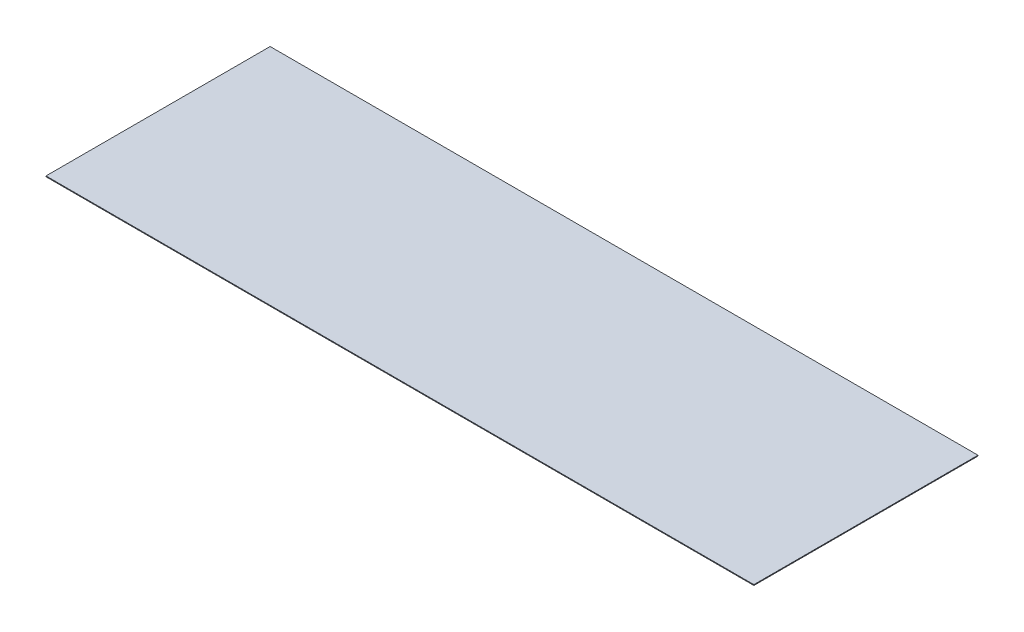
ISO-10303-21;
HEADER;
FILE_DESCRIPTION(('STEP AP214'),'2;1');
FILE_NAME('part.step','',(''),(''),'','','');
FILE_SCHEMA(('AUTOMOTIVE_DESIGN { 1 0 10303 214 1 1 1 1 }'));
ENDSEC;
DATA;
#1=APPLICATION_CONTEXT('core data for automotive mechanical design processes');
#2=APPLICATION_PROTOCOL_DEFINITION('international standard','automotive_design',2000,#1);
#3=PRODUCT_CONTEXT('',#1,'mechanical');
#4=PRODUCT('Part','Part','',(#3));
#5=PRODUCT_RELATED_PRODUCT_CATEGORY('part','',(#4));
#6=PRODUCT_DEFINITION_FORMATION('','',#4);
#7=PRODUCT_DEFINITION_CONTEXT('part definition',#1,'design');
#8=PRODUCT_DEFINITION('design','',#6,#7);
#9=PRODUCT_DEFINITION_SHAPE('','',#8);
#10=(LENGTH_UNIT() NAMED_UNIT(*) SI_UNIT(.MILLI.,.METRE.));
#11=(NAMED_UNIT(*) PLANE_ANGLE_UNIT() SI_UNIT($,.RADIAN.));
#12=(NAMED_UNIT(*) SI_UNIT($,.STERADIAN.) SOLID_ANGLE_UNIT());
#13=UNCERTAINTY_MEASURE_WITH_UNIT(LENGTH_MEASURE(1.E-05),#10,'distance_accuracy_value','');
#14=(GEOMETRIC_REPRESENTATION_CONTEXT(3) GLOBAL_UNCERTAINTY_ASSIGNED_CONTEXT((#13)) GLOBAL_UNIT_ASSIGNED_CONTEXT((#10,
#11,#12)) REPRESENTATION_CONTEXT('',''));
#15=CARTESIAN_POINT('',(0.,0.,0.));
#16=DIRECTION('',(0.,0.,1.));
#17=DIRECTION('',(1.,0.,0.));
#18=AXIS2_PLACEMENT_3D('',#15,#16,#17);
#19=CARTESIAN_POINT('',(-260.5254,0.6096,88.68));
#20=DIRECTION('',(1.,0.,0.));
#21=DIRECTION('',(0.,0.,-1.));
#22=AXIS2_PLACEMENT_3D('',#19,#20,#21);
#23=PLANE('',#22);
#24=DIRECTION('',(0.,0.,1.));
#25=VECTOR('',#24,1.);
#26=CARTESIAN_POINT('',(-260.5254,0.,88.68));
#27=LINE('',#26,#25);
#28=CARTESIAN_POINT('',(-260.5254,0.,-88.68));
#29=VERTEX_POINT('',#28);
#30=CARTESIAN_POINT('',(-260.5254,0.,88.68));
#31=VERTEX_POINT('',#30);
#32=EDGE_CURVE('E96',#29,#31,#27,.T.);
#33=ORIENTED_EDGE('',*,*,#32,.T.);
#34=DIRECTION('',(0.,-1.,0.));
#35=VECTOR('',#34,1.);
#36=CARTESIAN_POINT('',(-260.5254,0.6096,88.68));
#37=LINE('',#36,#35);
#38=CARTESIAN_POINT('',(-260.5254,0.6096,88.68));
#39=VERTEX_POINT('',#38);
#40=EDGE_CURVE('E11',#39,#31,#37,.T.);
#41=ORIENTED_EDGE('',*,*,#40,.F.);
#42=DIRECTION('',(0.,0.,1.));
#43=VECTOR('',#42,1.);
#44=CARTESIAN_POINT('',(-260.5254,0.6096,88.68));
#45=LINE('',#44,#43);
#46=CARTESIAN_POINT('',(-260.5254,0.6096,-88.68));
#47=VERTEX_POINT('',#46);
#48=EDGE_CURVE('E84',#47,#39,#45,.T.);
#49=ORIENTED_EDGE('',*,*,#48,.F.);
#50=DIRECTION('',(0.,-1.,0.));
#51=VECTOR('',#50,1.);
#52=CARTESIAN_POINT('',(-260.5254,0.6096,-88.68));
#53=LINE('',#52,#51);
#54=EDGE_CURVE('E92',#47,#29,#53,.T.);
#55=ORIENTED_EDGE('',*,*,#54,.T.);
#56=EDGE_LOOP('',(#33,#41,#49,#55));
#57=FACE_BOUND('',#56,.T.);
#58=ADVANCED_FACE('F33',(#57),#23,.F.);
#59=CARTESIAN_POINT('',(-260.5254,0.6096,88.68));
#60=DIRECTION('',(0.,0.,-1.));
#61=DIRECTION('',(-1.,0.,0.));
#62=AXIS2_PLACEMENT_3D('',#59,#60,#61);
#63=PLANE('',#62);
#64=DIRECTION('',(1.,0.,0.));
#65=VECTOR('',#64,1.);
#66=CARTESIAN_POINT('',(-260.5254,0.,88.68));
#67=LINE('',#66,#65);
#68=CARTESIAN_POINT('',(299.665,0.,88.68));
#69=VERTEX_POINT('',#68);
#70=EDGE_CURVE('E88',#31,#69,#67,.T.);
#71=ORIENTED_EDGE('',*,*,#70,.T.);
#72=DIRECTION('',(0.,-1.,0.));
#73=VECTOR('',#72,1.);
#74=CARTESIAN_POINT('',(299.665,0.6096,88.68));
#75=LINE('',#74,#73);
#76=CARTESIAN_POINT('',(299.665,0.6096,88.68));
#77=VERTEX_POINT('',#76);
#78=EDGE_CURVE('E41',#77,#69,#75,.T.);
#79=ORIENTED_EDGE('',*,*,#78,.F.);
#80=DIRECTION('',(1.,0.,0.));
#81=VECTOR('',#80,1.);
#82=CARTESIAN_POINT('',(-260.5254,0.6096,88.68));
#83=LINE('',#82,#81);
#84=EDGE_CURVE('E79',#39,#77,#83,.T.);
#85=ORIENTED_EDGE('',*,*,#84,.F.);
#86=ORIENTED_EDGE('',*,*,#40,.T.);
#87=EDGE_LOOP('',(#71,#79,#85,#86));
#88=FACE_BOUND('',#87,.T.);
#89=ADVANCED_FACE('F87',(#88),#63,.F.);
#90=CARTESIAN_POINT('',(299.665,0.6096,88.68));
#91=DIRECTION('',(-1.,0.,0.));
#92=DIRECTION('',(0.,0.,1.));
#93=AXIS2_PLACEMENT_3D('',#90,#91,#92);
#94=PLANE('',#93);
#95=DIRECTION('',(0.,0.,-1.));
#96=VECTOR('',#95,1.);
#97=CARTESIAN_POINT('',(299.665,0.,88.68));
#98=LINE('',#97,#96);
#99=CARTESIAN_POINT('',(299.665,0.,-88.68));
#100=VERTEX_POINT('',#99);
#101=EDGE_CURVE('E66',#69,#100,#98,.T.);
#102=ORIENTED_EDGE('',*,*,#101,.T.);
#103=DIRECTION('',(0.,-1.,0.));
#104=VECTOR('',#103,1.);
#105=CARTESIAN_POINT('',(299.665,0.6096,-88.68));
#106=LINE('',#105,#104);
#107=CARTESIAN_POINT('',(299.665,0.6096,-88.68));
#108=VERTEX_POINT('',#107);
#109=EDGE_CURVE('E89',#108,#100,#106,.T.);
#110=ORIENTED_EDGE('',*,*,#109,.F.);
#111=DIRECTION('',(0.,0.,-1.));
#112=VECTOR('',#111,1.);
#113=CARTESIAN_POINT('',(299.665,0.6096,88.68));
#114=LINE('',#113,#112);
#115=EDGE_CURVE('E82',#77,#108,#114,.T.);
#116=ORIENTED_EDGE('',*,*,#115,.F.);
#117=ORIENTED_EDGE('',*,*,#78,.T.);
#118=EDGE_LOOP('',(#102,#110,#116,#117));
#119=FACE_BOUND('',#118,.T.);
#120=ADVANCED_FACE('F90',(#119),#94,.F.);
#121=CARTESIAN_POINT('',(-260.5254,0.6096,-88.68));
#122=DIRECTION('',(0.,0.,1.));
#123=DIRECTION('',(1.,0.,0.));
#124=AXIS2_PLACEMENT_3D('',#121,#122,#123);
#125=PLANE('',#124);
#126=DIRECTION('',(-1.,0.,0.));
#127=VECTOR('',#126,1.);
#128=CARTESIAN_POINT('',(-260.5254,0.,-88.68));
#129=LINE('',#128,#127);
#130=EDGE_CURVE('E72',#100,#29,#129,.T.);
#131=ORIENTED_EDGE('',*,*,#130,.T.);
#132=ORIENTED_EDGE('',*,*,#54,.F.);
#133=DIRECTION('',(-1.,0.,0.));
#134=VECTOR('',#133,1.);
#135=CARTESIAN_POINT('',(-260.5254,0.6096,-88.68));
#136=LINE('',#135,#134);
#137=EDGE_CURVE('E49',#108,#47,#136,.T.);
#138=ORIENTED_EDGE('',*,*,#137,.F.);
#139=ORIENTED_EDGE('',*,*,#109,.T.);
#140=EDGE_LOOP('',(#131,#132,#138,#139));
#141=FACE_BOUND('',#140,.T.);
#142=ADVANCED_FACE('F103',(#141),#125,.F.);
#143=CARTESIAN_POINT('',(0.,0.6096,0.));
#144=DIRECTION('',(0.,-1.,0.));
#145=DIRECTION('',(0.,0.,-1.));
#146=AXIS2_PLACEMENT_3D('',#143,#144,#145);
#147=PLANE('',#146);
#148=ORIENTED_EDGE('',*,*,#48,.T.);
#149=ORIENTED_EDGE('',*,*,#84,.T.);
#150=ORIENTED_EDGE('',*,*,#115,.T.);
#151=ORIENTED_EDGE('',*,*,#137,.T.);
#152=EDGE_LOOP('',(#148,#149,#150,#151));
#153=FACE_BOUND('',#152,.T.);
#154=ADVANCED_FACE('F80',(#153),#147,.F.);
#155=CARTESIAN_POINT('',(0.,0.,0.));
#156=DIRECTION('',(0.,-1.,0.));
#157=DIRECTION('',(0.,0.,-1.));
#158=AXIS2_PLACEMENT_3D('',#155,#156,#157);
#159=PLANE('',#158);
#160=ORIENTED_EDGE('',*,*,#32,.F.);
#161=ORIENTED_EDGE('',*,*,#130,.F.);
#162=ORIENTED_EDGE('',*,*,#101,.F.);
#163=ORIENTED_EDGE('',*,*,#70,.F.);
#164=EDGE_LOOP('',(#160,#161,#162,#163));
#165=FACE_BOUND('',#164,.T.);
#166=ADVANCED_FACE('F106',(#165),#159,.T.);
#167=CLOSED_SHELL('',(#58,#89,#120,#142,#154,#166));
#168=MANIFOLD_SOLID_BREP('B2',#167);
#169=ADVANCED_BREP_SHAPE_REPRESENTATION('',(#18,#168),#14);
#170=SHAPE_DEFINITION_REPRESENTATION(#9,#169);
ENDSEC;
END-ISO-10303-21;
